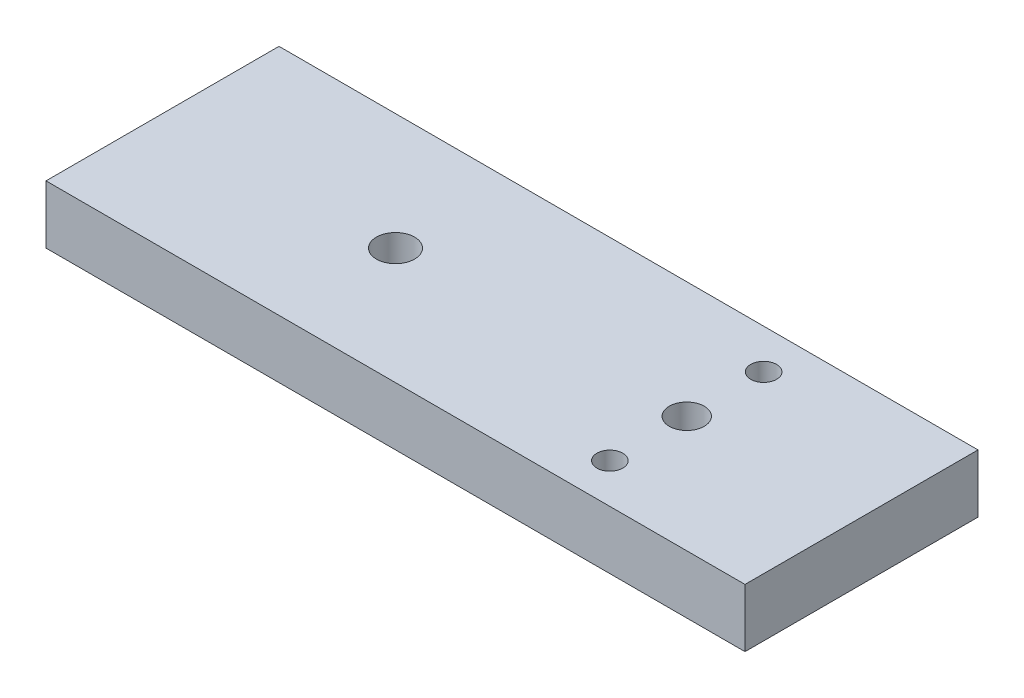
ISO-10303-21;
HEADER;
FILE_DESCRIPTION(('STEP AP214'),'2;1');
FILE_NAME('part.step','',(''),(''),'','','');
FILE_SCHEMA(('AUTOMOTIVE_DESIGN { 1 0 10303 214 1 1 1 1 }'));
ENDSEC;
DATA;
#1=APPLICATION_CONTEXT('core data for automotive mechanical design processes');
#2=APPLICATION_PROTOCOL_DEFINITION('international standard','automotive_design',2000,#1);
#3=PRODUCT_CONTEXT('',#1,'mechanical');
#4=PRODUCT('Part','Part','',(#3));
#5=PRODUCT_RELATED_PRODUCT_CATEGORY('part','',(#4));
#6=PRODUCT_DEFINITION_FORMATION('','',#4);
#7=PRODUCT_DEFINITION_CONTEXT('part definition',#1,'design');
#8=PRODUCT_DEFINITION('design','',#6,#7);
#9=PRODUCT_DEFINITION_SHAPE('','',#8);
#10=(LENGTH_UNIT() NAMED_UNIT(*) SI_UNIT(.MILLI.,.METRE.));
#11=(NAMED_UNIT(*) PLANE_ANGLE_UNIT() SI_UNIT($,.RADIAN.));
#12=(NAMED_UNIT(*) SI_UNIT($,.STERADIAN.) SOLID_ANGLE_UNIT());
#13=UNCERTAINTY_MEASURE_WITH_UNIT(LENGTH_MEASURE(1.E-05),#10,'distance_accuracy_value','');
#14=(GEOMETRIC_REPRESENTATION_CONTEXT(3) GLOBAL_UNCERTAINTY_ASSIGNED_CONTEXT((#13)) GLOBAL_UNIT_ASSIGNED_CONTEXT((#10,
#11,#12)) REPRESENTATION_CONTEXT('',''));
#15=CARTESIAN_POINT('',(0.,0.,0.));
#16=DIRECTION('',(0.,0.,1.));
#17=DIRECTION('',(1.,0.,0.));
#18=AXIS2_PLACEMENT_3D('',#15,#16,#17);
#19=CARTESIAN_POINT('',(0.,6.35,-25.4));
#20=DIRECTION('',(0.,0.,-1.));
#21=DIRECTION('',(-1.,0.,0.));
#22=AXIS2_PLACEMENT_3D('',#19,#20,#21);
#23=PLANE('',#22);
#24=DIRECTION('',(1.,0.,0.));
#25=VECTOR('',#24,1.);
#26=CARTESIAN_POINT('',(0.,0.,-25.4));
#27=LINE('',#26,#25);
#28=CARTESIAN_POINT('',(0.,0.,-25.4));
#29=VERTEX_POINT('',#28);
#30=CARTESIAN_POINT('',(76.2,0.,-25.4));
#31=VERTEX_POINT('',#30);
#32=EDGE_CURVE('E126',#29,#31,#27,.T.);
#33=ORIENTED_EDGE('',*,*,#32,.F.);
#34=DIRECTION('',(0.,-1.,0.));
#35=VECTOR('',#34,1.);
#36=CARTESIAN_POINT('',(0.,6.35,-25.4));
#37=LINE('',#36,#35);
#38=CARTESIAN_POINT('',(0.,6.35,-25.4));
#39=VERTEX_POINT('',#38);
#40=EDGE_CURVE('E11',#39,#29,#37,.T.);
#41=ORIENTED_EDGE('',*,*,#40,.F.);
#42=DIRECTION('',(1.,0.,0.));
#43=VECTOR('',#42,1.);
#44=CARTESIAN_POINT('',(0.,6.35,-25.4));
#45=LINE('',#44,#43);
#46=CARTESIAN_POINT('',(76.2,6.35,-25.4));
#47=VERTEX_POINT('',#46);
#48=EDGE_CURVE('E103',#39,#47,#45,.T.);
#49=ORIENTED_EDGE('',*,*,#48,.T.);
#50=DIRECTION('',(0.,-1.,0.));
#51=VECTOR('',#50,1.);
#52=CARTESIAN_POINT('',(76.2,6.35,-25.4));
#53=LINE('',#52,#51);
#54=EDGE_CURVE('E80',#47,#31,#53,.T.);
#55=ORIENTED_EDGE('',*,*,#54,.T.);
#56=EDGE_LOOP('',(#33,#41,#49,#55));
#57=FACE_BOUND('',#56,.T.);
#58=ADVANCED_FACE('F39',(#57),#23,.T.);
#59=CARTESIAN_POINT('',(0.,6.35,0.));
#60=DIRECTION('',(-1.,0.,0.));
#61=DIRECTION('',(0.,0.,1.));
#62=AXIS2_PLACEMENT_3D('',#59,#60,#61);
#63=PLANE('',#62);
#64=DIRECTION('',(0.,0.,-1.));
#65=VECTOR('',#64,1.);
#66=CARTESIAN_POINT('',(0.,0.,0.));
#67=LINE('',#66,#65);
#68=CARTESIAN_POINT('',(0.,0.,0.));
#69=VERTEX_POINT('',#68);
#70=EDGE_CURVE('E92',#69,#29,#67,.T.);
#71=ORIENTED_EDGE('',*,*,#70,.F.);
#72=DIRECTION('',(0.,-1.,0.));
#73=VECTOR('',#72,1.);
#74=CARTESIAN_POINT('',(0.,6.35,0.));
#75=LINE('',#74,#73);
#76=CARTESIAN_POINT('',(0.,6.35,0.));
#77=VERTEX_POINT('',#76);
#78=EDGE_CURVE('E49',#77,#69,#75,.T.);
#79=ORIENTED_EDGE('',*,*,#78,.F.);
#80=DIRECTION('',(0.,0.,-1.));
#81=VECTOR('',#80,1.);
#82=CARTESIAN_POINT('',(0.,6.35,0.));
#83=LINE('',#82,#81);
#84=EDGE_CURVE('E90',#77,#39,#83,.T.);
#85=ORIENTED_EDGE('',*,*,#84,.T.);
#86=ORIENTED_EDGE('',*,*,#40,.T.);
#87=EDGE_LOOP('',(#71,#79,#85,#86));
#88=FACE_BOUND('',#87,.T.);
#89=ADVANCED_FACE('F88',(#88),#63,.T.);
#90=CARTESIAN_POINT('',(0.,6.35,0.));
#91=DIRECTION('',(0.,0.,-1.));
#92=DIRECTION('',(-1.,0.,0.));
#93=AXIS2_PLACEMENT_3D('',#90,#91,#92);
#94=PLANE('',#93);
#95=DIRECTION('',(1.,0.,0.));
#96=VECTOR('',#95,1.);
#97=CARTESIAN_POINT('',(0.,0.,0.));
#98=LINE('',#97,#96);
#99=CARTESIAN_POINT('',(76.2,0.,0.));
#100=VERTEX_POINT('',#99);
#101=EDGE_CURVE('E131',#69,#100,#98,.T.);
#102=ORIENTED_EDGE('',*,*,#101,.T.);
#103=DIRECTION('',(0.,-1.,0.));
#104=VECTOR('',#103,1.);
#105=CARTESIAN_POINT('',(76.2,6.35,0.));
#106=LINE('',#105,#104);
#107=CARTESIAN_POINT('',(76.2,6.35,0.));
#108=VERTEX_POINT('',#107);
#109=EDGE_CURVE('E96',#108,#100,#106,.T.);
#110=ORIENTED_EDGE('',*,*,#109,.F.);
#111=DIRECTION('',(1.,0.,0.));
#112=VECTOR('',#111,1.);
#113=CARTESIAN_POINT('',(0.,6.35,0.));
#114=LINE('',#113,#112);
#115=EDGE_CURVE('E98',#77,#108,#114,.T.);
#116=ORIENTED_EDGE('',*,*,#115,.F.);
#117=ORIENTED_EDGE('',*,*,#78,.T.);
#118=EDGE_LOOP('',(#102,#110,#116,#117));
#119=FACE_BOUND('',#118,.T.);
#120=ADVANCED_FACE('F99',(#119),#94,.F.);
#121=CARTESIAN_POINT('',(57.15,6.35,-21.082));
#122=DIRECTION('',(0.,-1.,0.));
#123=DIRECTION('',(0.,0.,-1.));
#124=AXIS2_PLACEMENT_3D('',#121,#122,#123);
#125=CYLINDRICAL_SURFACE('',#124,1.41224000000001);
#126=CARTESIAN_POINT('',(57.15,6.35,-21.082));
#127=DIRECTION('',(0.,1.,0.));
#128=DIRECTION('',(0.,0.,1.));
#129=AXIS2_PLACEMENT_3D('',#126,#127,#128);
#130=CIRCLE('',#129,1.41224000000001);
#131=CARTESIAN_POINT('',(57.15,6.35,-19.66976));
#132=VERTEX_POINT('',#131);
#133=EDGE_CURVE('E107',#132,#132,#130,.T.);
#134=ORIENTED_EDGE('',*,*,#133,.T.);
#135=EDGE_LOOP('',(#134));
#136=FACE_BOUND('',#135,.T.);
#137=CARTESIAN_POINT('',(57.15,0.,-21.082));
#138=DIRECTION('',(0.,1.,0.));
#139=DIRECTION('',(0.,0.,1.));
#140=AXIS2_PLACEMENT_3D('',#137,#138,#139);
#141=CIRCLE('',#140,1.41224000000001);
#142=CARTESIAN_POINT('',(57.15,0.,-19.66976));
#143=VERTEX_POINT('',#142);
#144=EDGE_CURVE('E122',#143,#143,#141,.T.);
#145=ORIENTED_EDGE('',*,*,#144,.F.);
#146=EDGE_LOOP('',(#145));
#147=FACE_BOUND('',#146,.T.);
#148=ADVANCED_FACE('F151',(#136,#147),#125,.F.);
#149=CARTESIAN_POINT('',(57.15,6.35,-12.7));
#150=DIRECTION('',(0.,-1.,0.));
#151=DIRECTION('',(0.,0.,-1.));
#152=AXIS2_PLACEMENT_3D('',#149,#150,#151);
#153=CYLINDRICAL_SURFACE('',#152,1.905);
#154=CARTESIAN_POINT('',(57.15,6.35,-12.7));
#155=DIRECTION('',(0.,1.,0.));
#156=DIRECTION('',(0.,0.,1.));
#157=AXIS2_PLACEMENT_3D('',#154,#155,#156);
#158=CIRCLE('',#157,1.905);
#159=CARTESIAN_POINT('',(57.15,6.35,-10.795));
#160=VERTEX_POINT('',#159);
#161=EDGE_CURVE('E164',#160,#160,#158,.T.);
#162=ORIENTED_EDGE('',*,*,#161,.T.);
#163=EDGE_LOOP('',(#162));
#164=FACE_BOUND('',#163,.T.);
#165=CARTESIAN_POINT('',(57.15,0.,-12.7));
#166=DIRECTION('',(0.,1.,0.));
#167=DIRECTION('',(0.,0.,1.));
#168=AXIS2_PLACEMENT_3D('',#165,#166,#167);
#169=CIRCLE('',#168,1.905);
#170=CARTESIAN_POINT('',(57.15,0.,-10.795));
#171=VERTEX_POINT('',#170);
#172=EDGE_CURVE('E117',#171,#171,#169,.T.);
#173=ORIENTED_EDGE('',*,*,#172,.F.);
#174=EDGE_LOOP('',(#173));
#175=FACE_BOUND('',#174,.T.);
#176=ADVANCED_FACE('F153',(#164,#175),#153,.F.);
#177=CARTESIAN_POINT('',(57.15,6.35,-4.318));
#178=DIRECTION('',(0.,-1.,0.));
#179=DIRECTION('',(0.,0.,-1.));
#180=AXIS2_PLACEMENT_3D('',#177,#178,#179);
#181=CYLINDRICAL_SURFACE('',#180,1.41224000000001);
#182=CARTESIAN_POINT('',(57.15,6.35,-4.318));
#183=DIRECTION('',(0.,1.,0.));
#184=DIRECTION('',(0.,0.,1.));
#185=AXIS2_PLACEMENT_3D('',#182,#183,#184);
#186=CIRCLE('',#185,1.41224000000001);
#187=CARTESIAN_POINT('',(57.15,6.35,-2.90575999999999));
#188=VERTEX_POINT('',#187);
#189=EDGE_CURVE('E136',#188,#188,#186,.T.);
#190=ORIENTED_EDGE('',*,*,#189,.T.);
#191=EDGE_LOOP('',(#190));
#192=FACE_BOUND('',#191,.T.);
#193=CARTESIAN_POINT('',(57.15,0.,-4.318));
#194=DIRECTION('',(0.,1.,0.));
#195=DIRECTION('',(0.,0.,1.));
#196=AXIS2_PLACEMENT_3D('',#193,#194,#195);
#197=CIRCLE('',#196,1.41224000000001);
#198=CARTESIAN_POINT('',(57.15,0.,-2.90575999999999));
#199=VERTEX_POINT('',#198);
#200=EDGE_CURVE('E113',#199,#199,#197,.T.);
#201=ORIENTED_EDGE('',*,*,#200,.F.);
#202=EDGE_LOOP('',(#201));
#203=FACE_BOUND('',#202,.T.);
#204=ADVANCED_FACE('F41',(#192,#203),#181,.F.);
#205=CARTESIAN_POINT('',(76.2,6.35,0.));
#206=DIRECTION('',(-1.,0.,0.));
#207=DIRECTION('',(0.,0.,1.));
#208=AXIS2_PLACEMENT_3D('',#205,#206,#207);
#209=PLANE('',#208);
#210=DIRECTION('',(0.,0.,-1.));
#211=VECTOR('',#210,1.);
#212=CARTESIAN_POINT('',(76.2,0.,0.));
#213=LINE('',#212,#211);
#214=EDGE_CURVE('E73',#100,#31,#213,.T.);
#215=ORIENTED_EDGE('',*,*,#214,.T.);
#216=ORIENTED_EDGE('',*,*,#54,.F.);
#217=DIRECTION('',(0.,0.,-1.));
#218=VECTOR('',#217,1.);
#219=CARTESIAN_POINT('',(76.2,6.35,0.));
#220=LINE('',#219,#218);
#221=EDGE_CURVE('E57',#108,#47,#220,.T.);
#222=ORIENTED_EDGE('',*,*,#221,.F.);
#223=ORIENTED_EDGE('',*,*,#109,.T.);
#224=EDGE_LOOP('',(#215,#216,#222,#223));
#225=FACE_BOUND('',#224,.T.);
#226=ADVANCED_FACE('F141',(#225),#209,.F.);
#227=CARTESIAN_POINT('',(0.,6.35,0.));
#228=DIRECTION('',(0.,1.,0.));
#229=DIRECTION('',(0.,0.,1.));
#230=AXIS2_PLACEMENT_3D('',#227,#228,#229);
#231=PLANE('',#230);
#232=CARTESIAN_POINT('',(25.4,6.35,-12.7));
#233=DIRECTION('',(0.,1.,0.));
#234=DIRECTION('',(0.,0.,1.));
#235=AXIS2_PLACEMENT_3D('',#232,#233,#234);
#236=CIRCLE('',#235,2.0828);
#237=CARTESIAN_POINT('',(25.4,6.35,-10.6172));
#238=VERTEX_POINT('',#237);
#239=EDGE_CURVE('E245',#238,#238,#236,.T.);
#240=ORIENTED_EDGE('',*,*,#239,.F.);
#241=EDGE_LOOP('',(#240));
#242=FACE_BOUND('',#241,.T.);
#243=ORIENTED_EDGE('',*,*,#189,.F.);
#244=EDGE_LOOP('',(#243));
#245=FACE_BOUND('',#244,.T.);
#246=ORIENTED_EDGE('',*,*,#161,.F.);
#247=EDGE_LOOP('',(#246));
#248=FACE_BOUND('',#247,.T.);
#249=ORIENTED_EDGE('',*,*,#133,.F.);
#250=EDGE_LOOP('',(#249));
#251=FACE_BOUND('',#250,.T.);
#252=ORIENTED_EDGE('',*,*,#48,.F.);
#253=ORIENTED_EDGE('',*,*,#84,.F.);
#254=ORIENTED_EDGE('',*,*,#115,.T.);
#255=ORIENTED_EDGE('',*,*,#221,.T.);
#256=EDGE_LOOP('',(#252,#253,#254,#255));
#257=FACE_BOUND('',#256,.T.);
#258=ADVANCED_FACE('F102',(#242,#245,#248,#251,#257),#231,.T.);
#259=CARTESIAN_POINT('',(0.,0.,0.));
#260=DIRECTION('',(0.,1.,0.));
#261=DIRECTION('',(0.,0.,1.));
#262=AXIS2_PLACEMENT_3D('',#259,#260,#261);
#263=PLANE('',#262);
#264=CARTESIAN_POINT('',(25.4,0.,-12.7));
#265=DIRECTION('',(0.,1.,0.));
#266=DIRECTION('',(0.,0.,1.));
#267=AXIS2_PLACEMENT_3D('',#264,#265,#266);
#268=CIRCLE('',#267,2.0828);
#269=CARTESIAN_POINT('',(25.4,0.,-10.6172));
#270=VERTEX_POINT('',#269);
#271=EDGE_CURVE('E118',#270,#270,#268,.T.);
#272=ORIENTED_EDGE('',*,*,#271,.T.);
#273=EDGE_LOOP('',(#272));
#274=FACE_BOUND('',#273,.T.);
#275=ORIENTED_EDGE('',*,*,#200,.T.);
#276=EDGE_LOOP('',(#275));
#277=FACE_BOUND('',#276,.T.);
#278=ORIENTED_EDGE('',*,*,#172,.T.);
#279=EDGE_LOOP('',(#278));
#280=FACE_BOUND('',#279,.T.);
#281=ORIENTED_EDGE('',*,*,#144,.T.);
#282=EDGE_LOOP('',(#281));
#283=FACE_BOUND('',#282,.T.);
#284=ORIENTED_EDGE('',*,*,#32,.T.);
#285=ORIENTED_EDGE('',*,*,#214,.F.);
#286=ORIENTED_EDGE('',*,*,#101,.F.);
#287=ORIENTED_EDGE('',*,*,#70,.T.);
#288=EDGE_LOOP('',(#284,#285,#286,#287));
#289=FACE_BOUND('',#288,.T.);
#290=ADVANCED_FACE('F142',(#274,#277,#280,#283,#289),#263,.F.);
#291=CARTESIAN_POINT('',(25.4,0.,-12.7));
#292=DIRECTION('',(0.,1.,0.));
#293=DIRECTION('',(0.,0.,1.));
#294=AXIS2_PLACEMENT_3D('',#291,#292,#293);
#295=CYLINDRICAL_SURFACE('',#294,2.0828);
#296=ORIENTED_EDGE('',*,*,#271,.F.);
#297=EDGE_LOOP('',(#296));
#298=FACE_BOUND('',#297,.T.);
#299=ORIENTED_EDGE('',*,*,#239,.T.);
#300=EDGE_LOOP('',(#299));
#301=FACE_BOUND('',#300,.T.);
#302=ADVANCED_FACE('F169',(#298,#301),#295,.F.);
#303=CLOSED_SHELL('',(#58,#89,#120,#148,#176,#204,#226,#258,#290,#302));
#304=MANIFOLD_SOLID_BREP('B2',#303);
#305=ADVANCED_BREP_SHAPE_REPRESENTATION('',(#18,#304),#14);
#306=SHAPE_DEFINITION_REPRESENTATION(#9,#305);
ENDSEC;
END-ISO-10303-21;
